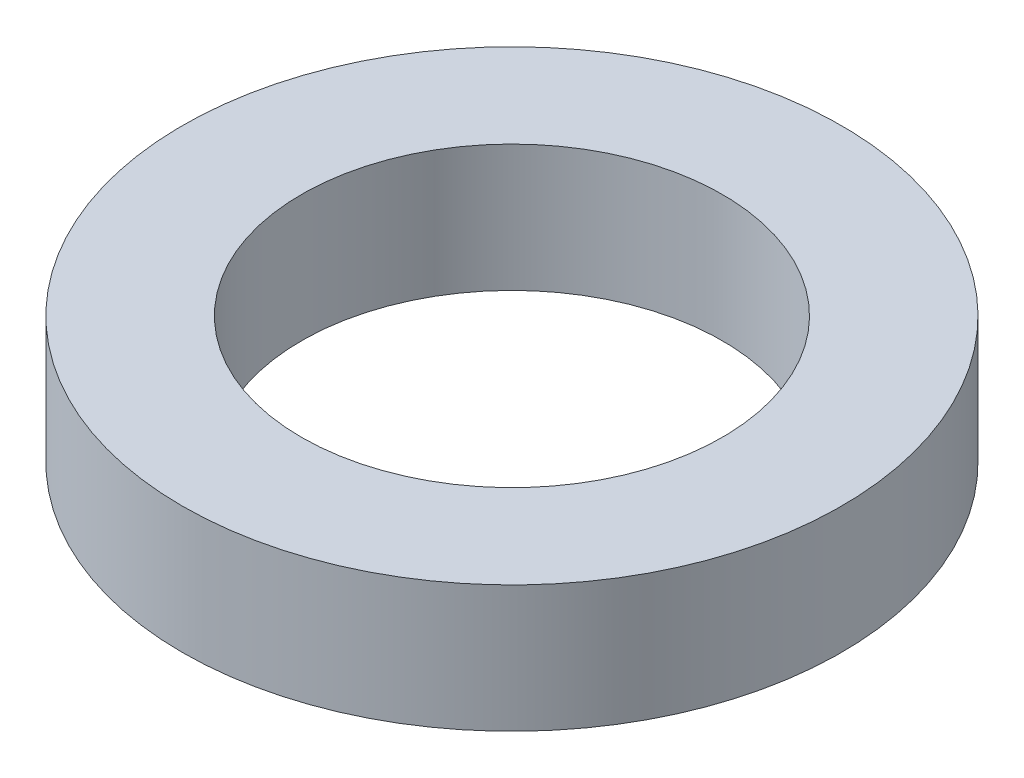
ISO-10303-21;
HEADER;
FILE_DESCRIPTION(('STEP AP214'),'2;1');
FILE_NAME('part.step','',(''),(''),'','','');
FILE_SCHEMA(('AUTOMOTIVE_DESIGN { 1 0 10303 214 1 1 1 1 }'));
ENDSEC;
DATA;
#1=APPLICATION_CONTEXT('core data for automotive mechanical design processes');
#2=APPLICATION_PROTOCOL_DEFINITION('international standard','automotive_design',2000,#1);
#3=PRODUCT_CONTEXT('',#1,'mechanical');
#4=PRODUCT('Part','Part','',(#3));
#5=PRODUCT_RELATED_PRODUCT_CATEGORY('part','',(#4));
#6=PRODUCT_DEFINITION_FORMATION('','',#4);
#7=PRODUCT_DEFINITION_CONTEXT('part definition',#1,'design');
#8=PRODUCT_DEFINITION('design','',#6,#7);
#9=PRODUCT_DEFINITION_SHAPE('','',#8);
#10=(LENGTH_UNIT() NAMED_UNIT(*) SI_UNIT(.MILLI.,.METRE.));
#11=(NAMED_UNIT(*) PLANE_ANGLE_UNIT() SI_UNIT($,.RADIAN.));
#12=(NAMED_UNIT(*) SI_UNIT($,.STERADIAN.) SOLID_ANGLE_UNIT());
#13=UNCERTAINTY_MEASURE_WITH_UNIT(LENGTH_MEASURE(1.E-05),#10,'distance_accuracy_value','');
#14=(GEOMETRIC_REPRESENTATION_CONTEXT(3) GLOBAL_UNCERTAINTY_ASSIGNED_CONTEXT((#13)) GLOBAL_UNIT_ASSIGNED_CONTEXT((#10,
#11,#12)) REPRESENTATION_CONTEXT('',''));
#15=CARTESIAN_POINT('',(0.,0.,0.));
#16=DIRECTION('',(0.,0.,1.));
#17=DIRECTION('',(1.,0.,0.));
#18=AXIS2_PLACEMENT_3D('',#15,#16,#17);
#19=CARTESIAN_POINT('',(0.,0.,0.));
#20=DIRECTION('',(0.,1.,0.));
#21=DIRECTION('',(0.,0.,1.));
#22=AXIS2_PLACEMENT_3D('',#19,#20,#21);
#23=CYLINDRICAL_SURFACE('',#22,6.5);
#24=CARTESIAN_POINT('',(0.,0.,0.));
#25=DIRECTION('',(0.,1.,0.));
#26=DIRECTION('',(0.,0.,1.));
#27=AXIS2_PLACEMENT_3D('',#24,#25,#26);
#28=CIRCLE('',#27,6.5);
#29=CARTESIAN_POINT('',(0.,0.,6.5));
#30=VERTEX_POINT('',#29);
#31=EDGE_CURVE('E10',#30,#30,#28,.T.);
#32=ORIENTED_EDGE('',*,*,#31,.T.);
#33=EDGE_LOOP('',(#32));
#34=FACE_BOUND('',#33,.T.);
#35=CARTESIAN_POINT('',(0.,2.5,0.));
#36=DIRECTION('',(0.,1.,0.));
#37=DIRECTION('',(0.,0.,1.));
#38=AXIS2_PLACEMENT_3D('',#35,#36,#37);
#39=CIRCLE('',#38,6.5);
#40=CARTESIAN_POINT('',(0.,2.5,6.5));
#41=VERTEX_POINT('',#40);
#42=EDGE_CURVE('E42',#41,#41,#39,.T.);
#43=ORIENTED_EDGE('',*,*,#42,.F.);
#44=EDGE_LOOP('',(#43));
#45=FACE_BOUND('',#44,.T.);
#46=ADVANCED_FACE('F28',(#34,#45),#23,.T.);
#47=CARTESIAN_POINT('',(-6.5,0.,0.));
#48=DIRECTION('',(0.,-1.,0.));
#49=DIRECTION('',(0.,0.,-1.));
#50=AXIS2_PLACEMENT_3D('',#47,#48,#49);
#51=PLANE('',#50);
#52=CARTESIAN_POINT('',(0.,0.,0.));
#53=DIRECTION('',(0.,1.,0.));
#54=DIRECTION('',(0.,0.,1.));
#55=AXIS2_PLACEMENT_3D('',#52,#53,#54);
#56=CIRCLE('',#55,4.15);
#57=CARTESIAN_POINT('',(0.,0.,4.15));
#58=VERTEX_POINT('',#57);
#59=EDGE_CURVE('E34',#58,#58,#56,.T.);
#60=ORIENTED_EDGE('',*,*,#59,.T.);
#61=EDGE_LOOP('',(#60));
#62=FACE_BOUND('',#61,.T.);
#63=ORIENTED_EDGE('',*,*,#31,.F.);
#64=EDGE_LOOP('',(#63));
#65=FACE_BOUND('',#64,.T.);
#66=ADVANCED_FACE('F52',(#62,#65),#51,.T.);
#67=CARTESIAN_POINT('',(0.,0.,0.));
#68=DIRECTION('',(0.,1.,0.));
#69=DIRECTION('',(0.,0.,1.));
#70=AXIS2_PLACEMENT_3D('',#67,#68,#69);
#71=CYLINDRICAL_SURFACE('',#70,4.15);
#72=CARTESIAN_POINT('',(0.,2.5,0.));
#73=DIRECTION('',(0.,1.,0.));
#74=DIRECTION('',(0.,0.,1.));
#75=AXIS2_PLACEMENT_3D('',#72,#73,#74);
#76=CIRCLE('',#75,4.15);
#77=CARTESIAN_POINT('',(0.,2.5,4.15));
#78=VERTEX_POINT('',#77);
#79=EDGE_CURVE('E38',#78,#78,#76,.T.);
#80=ORIENTED_EDGE('',*,*,#79,.T.);
#81=EDGE_LOOP('',(#80));
#82=FACE_BOUND('',#81,.T.);
#83=ORIENTED_EDGE('',*,*,#59,.F.);
#84=EDGE_LOOP('',(#83));
#85=FACE_BOUND('',#84,.T.);
#86=ADVANCED_FACE('F56',(#82,#85),#71,.F.);
#87=CARTESIAN_POINT('',(-6.5,2.5,0.));
#88=DIRECTION('',(0.,1.,0.));
#89=DIRECTION('',(0.,0.,1.));
#90=AXIS2_PLACEMENT_3D('',#87,#88,#89);
#91=PLANE('',#90);
#92=ORIENTED_EDGE('',*,*,#42,.T.);
#93=EDGE_LOOP('',(#92));
#94=FACE_BOUND('',#93,.T.);
#95=ORIENTED_EDGE('',*,*,#79,.F.);
#96=EDGE_LOOP('',(#95));
#97=FACE_BOUND('',#96,.T.);
#98=ADVANCED_FACE('F48',(#94,#97),#91,.T.);
#99=CLOSED_SHELL('',(#46,#66,#86,#98));
#100=MANIFOLD_SOLID_BREP('B2',#99);
#101=ADVANCED_BREP_SHAPE_REPRESENTATION('',(#18,#100),#14);
#102=SHAPE_DEFINITION_REPRESENTATION(#9,#101);
ENDSEC;
END-ISO-10303-21;
